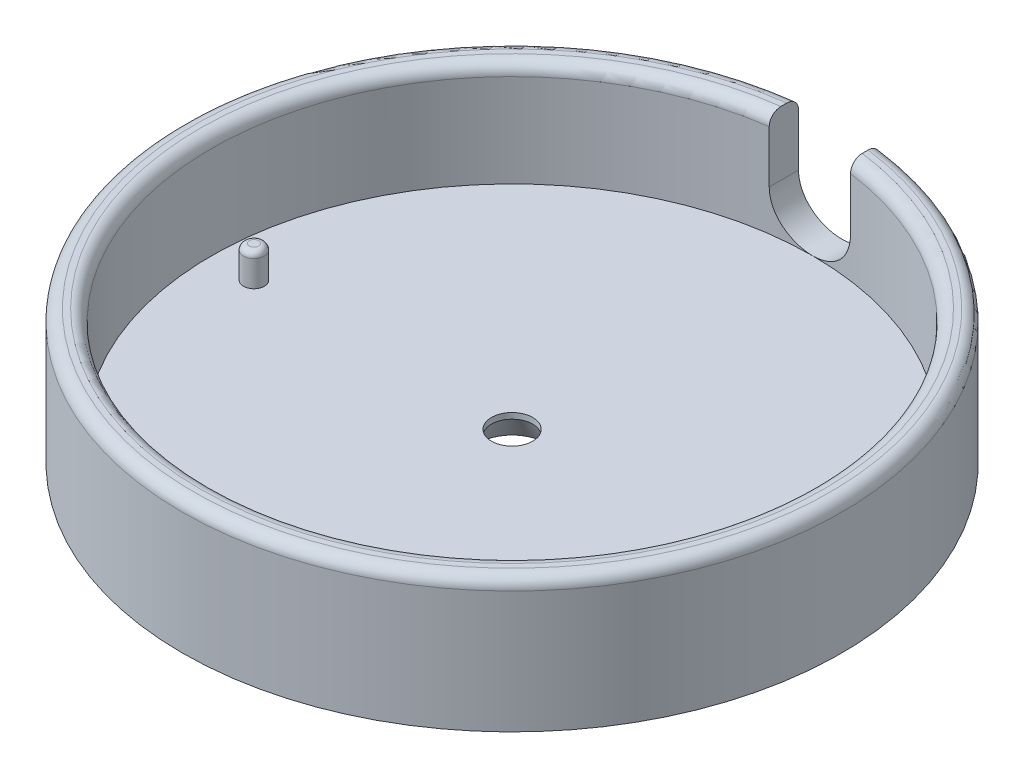
ISO-10303-21;
HEADER;
FILE_DESCRIPTION(('STEP AP214'),'2;1');
FILE_NAME('part.step','',(''),(''),'','','');
FILE_SCHEMA(('AUTOMOTIVE_DESIGN { 1 0 10303 214 1 1 1 1 }'));
ENDSEC;
DATA;
#1=APPLICATION_CONTEXT('core data for automotive mechanical design processes');
#2=APPLICATION_PROTOCOL_DEFINITION('international standard','automotive_design',2000,#1);
#3=PRODUCT_CONTEXT('',#1,'mechanical');
#4=PRODUCT('Part','Part','',(#3));
#5=PRODUCT_RELATED_PRODUCT_CATEGORY('part','',(#4));
#6=PRODUCT_DEFINITION_FORMATION('','',#4);
#7=PRODUCT_DEFINITION_CONTEXT('part definition',#1,'design');
#8=PRODUCT_DEFINITION('design','',#6,#7);
#9=PRODUCT_DEFINITION_SHAPE('','',#8);
#10=(LENGTH_UNIT() NAMED_UNIT(*) SI_UNIT(.MILLI.,.METRE.));
#11=(NAMED_UNIT(*) PLANE_ANGLE_UNIT() SI_UNIT($,.RADIAN.));
#12=(NAMED_UNIT(*) SI_UNIT($,.STERADIAN.) SOLID_ANGLE_UNIT());
#13=UNCERTAINTY_MEASURE_WITH_UNIT(LENGTH_MEASURE(1.E-05),#10,'distance_accuracy_value','');
#14=(GEOMETRIC_REPRESENTATION_CONTEXT(3) GLOBAL_UNCERTAINTY_ASSIGNED_CONTEXT((#13)) GLOBAL_UNIT_ASSIGNED_CONTEXT((#10,
#11,#12)) REPRESENTATION_CONTEXT('',''));
#15=CARTESIAN_POINT('',(0.,0.,0.));
#16=DIRECTION('',(0.,0.,1.));
#17=DIRECTION('',(1.,0.,0.));
#18=AXIS2_PLACEMENT_3D('',#15,#16,#17);
#19=CARTESIAN_POINT('',(0.,23.,0.));
#20=DIRECTION('',(0.,1.,0.));
#21=DIRECTION('',(0.,0.,1.));
#22=AXIS2_PLACEMENT_3D('',#19,#20,#21);
#23=PLANE('',#22);
#24=DIRECTION('',(0.,0.,-1.));
#25=VECTOR('',#24,1.);
#26=CARTESIAN_POINT('',(-7.,23.,-51.25));
#27=LINE('',#26,#25);
#28=CARTESIAN_POINT('',(-7.,23.,-53.2922367704715));
#29=VERTEX_POINT('',#28);
#30=CARTESIAN_POINT('',(-7.,23.,-54.3006675833732));
#31=VERTEX_POINT('',#30);
#32=EDGE_CURVE('E116',#29,#31,#27,.T.);
#33=ORIENTED_EDGE('',*,*,#32,.T.);
#34=CARTESIAN_POINT('',(0.,23.,0.));
#35=DIRECTION('',(0.,1.,0.));
#36=DIRECTION('',(0.,0.,1.));
#37=AXIS2_PLACEMENT_3D('',#34,#35,#36);
#38=CIRCLE('',#37,54.75);
#39=CARTESIAN_POINT('',(7.,23.,-54.3006675833732));
#40=VERTEX_POINT('',#39);
#41=EDGE_CURVE('E171',#31,#40,#38,.T.);
#42=ORIENTED_EDGE('',*,*,#41,.T.);
#43=DIRECTION('',(0.,0.,-1.));
#44=VECTOR('',#43,1.);
#45=CARTESIAN_POINT('',(7.,23.,-51.25));
#46=LINE('',#45,#44);
#47=CARTESIAN_POINT('',(7.,23.,-53.2922367704715));
#48=VERTEX_POINT('',#47);
#49=EDGE_CURVE('E127',#48,#40,#46,.T.);
#50=ORIENTED_EDGE('',*,*,#49,.F.);
#51=CARTESIAN_POINT('',(0.,23.,0.));
#52=DIRECTION('',(0.,1.,0.));
#53=DIRECTION('',(0.,0.,1.));
#54=AXIS2_PLACEMENT_3D('',#51,#52,#53);
#55=CIRCLE('',#54,53.75);
#56=EDGE_CURVE('E231',#48,#29,#55,.F.);
#57=ORIENTED_EDGE('',*,*,#56,.T.);
#58=EDGE_LOOP('',(#33,#42,#50,#57));
#59=FACE_BOUND('',#58,.T.);
#60=ADVANCED_FACE('F37',(#59),#23,.T.);
#61=CARTESIAN_POINT('',(0.,23.,0.));
#62=DIRECTION('',(0.,-1.,0.));
#63=DIRECTION('',(0.,0.,-1.));
#64=AXIS2_PLACEMENT_3D('',#61,#62,#63);
#65=CYLINDRICAL_SURFACE('',#64,56.75);
#66=DIRECTION('',(0.,-1.,0.));
#67=VECTOR('',#66,1.);
#68=CARTESIAN_POINT('',(7.,23.,-56.3166272072467));
#69=LINE('',#68,#67);
#70=CARTESIAN_POINT('',(7.,12.,-56.3166272072467));
#71=VERTEX_POINT('',#70);
#72=CARTESIAN_POINT('',(7.,21.,-56.3166272072467));
#73=VERTEX_POINT('',#72);
#74=EDGE_CURVE('E242',#71,#73,#69,.F.);
#75=ORIENTED_EDGE('',*,*,#74,.T.);
#76=CARTESIAN_POINT('',(0.,21.,0.));
#77=DIRECTION('',(0.,1.,0.));
#78=DIRECTION('',(0.,0.,1.));
#79=AXIS2_PLACEMENT_3D('',#76,#77,#78);
#80=CIRCLE('',#79,56.75);
#81=CARTESIAN_POINT('',(-7.,21.,-56.3166272072467));
#82=VERTEX_POINT('',#81);
#83=EDGE_CURVE('E52',#73,#82,#80,.F.);
#84=ORIENTED_EDGE('',*,*,#83,.T.);
#85=DIRECTION('',(0.,-1.,0.));
#86=VECTOR('',#85,1.);
#87=CARTESIAN_POINT('',(-7.,23.,-56.3166272072467));
#88=LINE('',#87,#86);
#89=CARTESIAN_POINT('',(-7.,12.,-56.3166272072467));
#90=VERTEX_POINT('',#89);
#91=EDGE_CURVE('E125',#90,#82,#88,.F.);
#92=ORIENTED_EDGE('',*,*,#91,.F.);
#93=CARTESIAN_POINT('',(7.,12.,-56.3166272072467));
#94=CARTESIAN_POINT('',(7.0000219947488,11.8039192833883,-56.3166167165276));
#95=CARTESIAN_POINT('',(6.99176215755773,11.6078427299237,-56.317650908035));
#96=CARTESIAN_POINT('',(6.95883845174181,11.2171072061736,-56.3217327137754));
#97=CARTESIAN_POINT('',(6.93417583371401,11.0224481289592,-56.3247801745107));
#98=CARTESIAN_POINT('',(6.86863942021842,10.6361225939024,-56.3328085232744));
#99=CARTESIAN_POINT('',(6.82778209952862,10.4444532998886,-56.3377874463279));
#100=CARTESIAN_POINT('',(6.73016541288054,10.0652660164368,-56.3495324227022));
#101=CARTESIAN_POINT('',(6.67340614414638,9.87774800162542,-56.3562984650966));
#102=CARTESIAN_POINT('',(6.54439015261551,9.50815825652045,-56.3714259910238));
#103=CARTESIAN_POINT('',(6.47213121349918,9.32608730935767,-56.3797877027047));
#104=CARTESIAN_POINT('',(6.31261496894473,8.96862873139894,-56.3978708341402));
#105=CARTESIAN_POINT('',(6.22535212563003,8.79324359761343,-56.4075927556947));
#106=CARTESIAN_POINT('',(6.03651433470211,8.45052735678081,-56.4281136094258));
#107=CARTESIAN_POINT('',(5.93494595489324,8.28319260076477,-56.438912046703));
#108=CARTESIAN_POINT('',(5.71814472768462,7.95758852430412,-56.4612893594266));
#109=CARTESIAN_POINT('',(5.60290682148673,7.79932259237323,-56.4728685231147));
#110=CARTESIAN_POINT('',(5.35906668017131,7.49234015590616,-56.4965305953659));
#111=CARTESIAN_POINT('',(5.23040781153958,7.34366878734962,-56.5086154982338));
#112=CARTESIAN_POINT('',(4.96100027032113,7.05762289775819,-56.5329043133369));
#113=CARTESIAN_POINT('',(4.82024714408787,6.92025257503889,-56.5451082679329));
#114=CARTESIAN_POINT('',(4.52770510511461,6.65785754123238,-56.569284223706));
#115=CARTESIAN_POINT('',(4.37591857480362,6.53283017861374,-56.5812562742548));
#116=CARTESIAN_POINT('',(4.06228159002892,6.29592199567634,-56.6046385094118));
#117=CARTESIAN_POINT('',(3.90042744317173,6.18404604275432,-56.6160484850916));
#118=CARTESIAN_POINT('',(3.56736236506161,5.97398977520248,-56.6380115550347));
#119=CARTESIAN_POINT('',(3.39612619778109,5.87584920454318,-56.6485621271987));
#120=CARTESIAN_POINT('',(3.04585974499131,5.69431503152571,-56.6684746197739));
#121=CARTESIAN_POINT('',(2.86682659168836,5.61092691330792,-56.6778360977829));
#122=CARTESIAN_POINT('',(2.50237836163341,5.45958592835696,-56.6950955844627));
#123=CARTESIAN_POINT('',(2.3169662387491,5.39162602527534,-56.7029942599702));
#124=CARTESIAN_POINT('',(1.94093612787971,5.27157273000776,-56.7171109570437));
#125=CARTESIAN_POINT('',(1.75031626135847,5.21948514787358,-56.7233283630888));
#126=CARTESIAN_POINT('',(1.36632334306685,5.13183144824462,-56.7338730770446));
#127=CARTESIAN_POINT('',(1.17297013023706,5.09617958993406,-56.7382101867272));
#128=CARTESIAN_POINT('',(0.783913130054273,5.04125903398579,-56.7449189907224));
#129=CARTESIAN_POINT('',(0.588209305099474,5.02199059878211,-56.7472906535519));
#130=CARTESIAN_POINT('',(0.195864225014644,4.99998276297641,-56.7500010705255));
#131=CARTESIAN_POINT('',(-0.000777011845855551,4.99724304154819,-56.750339864128));
#132=CARTESIAN_POINT('',(-0.393585748059021,5.00831241736332,-56.7489750149214));
#133=CARTESIAN_POINT('',(-0.589753248628854,5.02212147204262,-56.7472713773655));
#134=CARTESIAN_POINT('',(-0.979140420472035,5.06606434744224,-56.7418848172176));
#135=CARTESIAN_POINT('',(-1.17237032639893,5.09610887644951,-56.7382127216086));
#136=CARTESIAN_POINT('',(-1.55559379608271,5.17224112267777,-56.7289993343274));
#137=CARTESIAN_POINT('',(-1.74558742231589,5.21832852982234,-56.7234580787823));
#138=CARTESIAN_POINT('',(-2.12103928238718,5.32621912073602,-56.710660236408));
#139=CARTESIAN_POINT('',(-2.30649661725121,5.3880253923514,-56.7034033125691));
#140=CARTESIAN_POINT('',(-2.6714719288465,5.5268750987148,-56.6873803920868));
#141=CARTESIAN_POINT('',(-2.85099201471713,5.60391305321918,-56.6786149383473));
#142=CARTESIAN_POINT('',(-3.2034442681749,5.77294147345537,-56.6597889748952));
#143=CARTESIAN_POINT('',(-3.37635500002979,5.86497620978211,-56.6497246497804));
#144=CARTESIAN_POINT('',(-3.7137529198488,6.06314035435097,-56.6286067719244));
#145=CARTESIAN_POINT('',(-3.87824312695745,6.16926466109304,-56.6175535776996));
#146=CARTESIAN_POINT('',(-4.19778797290129,6.39492659273412,-56.594759011449));
#147=CARTESIAN_POINT('',(-4.35283919823904,6.51446902621754,-56.583017393441));
#148=CARTESIAN_POINT('',(-4.65231744745773,6.7660555299394,-56.5591814263943));
#149=CARTESIAN_POINT('',(-4.79674829161066,6.89809506535107,-56.5470872063984));
#150=CARTESIAN_POINT('',(-5.07501016998412,7.17475092700739,-56.5227955470212));
#151=CARTESIAN_POINT('',(-5.20876111030783,7.31944781404099,-56.510597971631));
#152=CARTESIAN_POINT('',(-5.46355852317211,7.61955921356125,-56.486532937262));
#153=CARTESIAN_POINT('',(-5.58460962324378,7.77496978778079,-56.4746653592063));
#154=CARTESIAN_POINT('',(-5.81328558888287,8.09557852403909,-56.4515848430717));
#155=CARTESIAN_POINT('',(-5.92090137354622,8.26078319584137,-56.4403723504582));
#156=CARTESIAN_POINT('',(-6.12180525963692,8.5996638102584,-56.4189348286499));
#157=CARTESIAN_POINT('',(-6.21509871223984,8.77333655687963,-56.4087094311847));
#158=CARTESIAN_POINT('',(-6.38685140026761,9.1282330355501,-56.3895212880484));
#159=CARTESIAN_POINT('',(-6.46528999225263,9.30946685466405,-56.3805603038439));
#160=CARTESIAN_POINT('',(-6.60657125544975,9.67790474021782,-56.3641798995163));
#161=CARTESIAN_POINT('',(-6.66941987242731,9.86510649974596,-56.3567598918658));
#162=CARTESIAN_POINT('',(-6.77903487798435,10.2439983766349,-56.3436796140353));
#163=CARTESIAN_POINT('',(-6.82581847881343,10.4356834537544,-56.3380174610968));
#164=CARTESIAN_POINT('',(-6.90302983079664,10.8222873505845,-56.3286090264939));
#165=CARTESIAN_POINT('',(-6.93346550841211,11.0172045558177,-56.3248618163924));
#166=CARTESIAN_POINT('',(-6.97041292359321,11.3437555761579,-56.3202988538142));
#167=CARTESIAN_POINT('',(-6.98151460865604,11.4748801495813,-56.3189226582198));
#168=CARTESIAN_POINT('',(-6.99630319355143,11.7373321163569,-56.3170867253703));
#169=CARTESIAN_POINT('',(-7.0000025158974,11.8686587991465,-56.3166254527192));
#170=CARTESIAN_POINT('',(-7.,12.,-56.3166272072467));
#171=B_SPLINE_CURVE_WITH_KNOTS('',3,(#93,#94,#95,#96,#97,#98,#99,#100,#101,#102,#103,#104,#105,
#106,#107,#108,#109,#110,#111,#112,#113,#114,#115,#116,#117,#118,#119,#120,#121,#122,#123,#124,
#125,#126,#127,#128,#129,#130,#131,#132,#133,#134,#135,#136,#137,#138,#139,#140,#141,#142,#143,
#144,#145,#146,#147,#148,#149,#150,#151,#152,#153,#154,#155,#156,#157,#158,#159,#160,#161,#162,
#163,#164,#165,#166,#167,#168,#169,#170),.UNSPECIFIED.,.F.,.F.,(4,2,2,2,2,2,2,2,2,2,2,2,2,2,2,2,
2,2,2,2,2,2,2,2,2,2,2,2,2,2,2,2,2,2,2,2,2,2,4),(0.,0.58805944615343,1.17607406203529,
1.76349202298622,2.35090639255734,2.93840481339397,3.52612054469861,4.11356732451133,
4.70123218803348,5.29148570216968,5.88195751328518,6.47230220115773,7.06286469495111,
7.65510216136117,8.24755932816906,8.83974574768157,9.43214867693543,10.0214252171703,
10.6107111964161,11.1999857374464,11.7892587628444,12.375323412985,12.9613767363088,
13.5475452742043,14.1335032956457,14.7212234940363,15.3087314702607,15.896450664944,
16.4839574055336,17.0755216212762,17.6668695303922,18.2586149910903,18.8501388202139,
19.4424787386882,20.034592399716,20.6260696691255,21.2172598951318,21.6118646349531,
22.0058065988666),.UNSPECIFIED.);
#172=EDGE_CURVE('E115',#71,#90,#171,.T.);
#173=ORIENTED_EDGE('',*,*,#172,.F.);
#174=EDGE_LOOP('',(#75,#84,#92,#173));
#175=FACE_BOUND('',#174,.T.);
#176=CARTESIAN_POINT('',(0.,0.,0.));
#177=DIRECTION('',(0.,1.,0.));
#178=DIRECTION('',(0.,0.,1.));
#179=AXIS2_PLACEMENT_3D('',#176,#177,#178);
#180=CIRCLE('',#179,56.75);
#181=CARTESIAN_POINT('',(0.,0.,56.75));
#182=VERTEX_POINT('',#181);
#183=EDGE_CURVE('E255',#182,#182,#180,.T.);
#184=ORIENTED_EDGE('',*,*,#183,.T.);
#185=EDGE_LOOP('',(#184));
#186=FACE_BOUND('',#185,.T.);
#187=ADVANCED_FACE('F197',(#175,#186),#65,.T.);
#188=CARTESIAN_POINT('',(0.,0.,0.));
#189=DIRECTION('',(0.,1.,0.));
#190=DIRECTION('',(0.,0.,1.));
#191=AXIS2_PLACEMENT_3D('',#188,#189,#190);
#192=PLANE('',#191);
#193=CARTESIAN_POINT('',(0.,0.,0.));
#194=DIRECTION('',(0.,1.,0.));
#195=DIRECTION('',(0.,0.,1.));
#196=AXIS2_PLACEMENT_3D('',#193,#194,#195);
#197=CIRCLE('',#196,5.8594010767585);
#198=CARTESIAN_POINT('',(0.,0.,5.8594010767585));
#199=VERTEX_POINT('',#198);
#200=EDGE_CURVE('E45',#199,#199,#197,.T.);
#201=ORIENTED_EDGE('',*,*,#200,.T.);
#202=EDGE_LOOP('',(#201));
#203=FACE_BOUND('',#202,.T.);
#204=ORIENTED_EDGE('',*,*,#183,.F.);
#205=EDGE_LOOP('',(#204));
#206=FACE_BOUND('',#205,.T.);
#207=ADVANCED_FACE('F188',(#203,#206),#192,.F.);
#208=CARTESIAN_POINT('',(0.,5.,0.));
#209=DIRECTION('',(0.,1.,0.));
#210=DIRECTION('',(0.,0.,1.));
#211=AXIS2_PLACEMENT_3D('',#208,#209,#210);
#212=CYLINDRICAL_SURFACE('',#211,51.75);
#213=DIRECTION('',(0.,1.,0.));
#214=VECTOR('',#213,1.);
#215=CARTESIAN_POINT('',(-7.,5.,-51.2743844429165));
#216=LINE('',#215,#214);
#217=CARTESIAN_POINT('',(-7.,21.,-51.2743844429165));
#218=VERTEX_POINT('',#217);
#219=CARTESIAN_POINT('',(-7.,12.,-51.2743844429165));
#220=VERTEX_POINT('',#219);
#221=EDGE_CURVE('E94',#218,#220,#216,.F.);
#222=ORIENTED_EDGE('',*,*,#221,.F.);
#223=CARTESIAN_POINT('',(0.,21.,0.));
#224=DIRECTION('',(0.,1.,0.));
#225=DIRECTION('',(0.,0.,1.));
#226=AXIS2_PLACEMENT_3D('',#223,#224,#225);
#227=CIRCLE('',#226,51.75);
#228=CARTESIAN_POINT('',(7.00000000000001,21.,-51.2743844429165));
#229=VERTEX_POINT('',#228);
#230=EDGE_CURVE('E229',#218,#229,#227,.T.);
#231=ORIENTED_EDGE('',*,*,#230,.T.);
#232=DIRECTION('',(0.,1.,0.));
#233=VECTOR('',#232,1.);
#234=CARTESIAN_POINT('',(7.00000000000001,5.,-51.2743844429165));
#235=LINE('',#234,#233);
#236=CARTESIAN_POINT('',(7.,12.,-51.2743844429165));
#237=VERTEX_POINT('',#236);
#238=EDGE_CURVE('E105',#229,#237,#235,.F.);
#239=ORIENTED_EDGE('',*,*,#238,.T.);
#240=CARTESIAN_POINT('',(-7.,12.,-51.2743844429165));
#241=CARTESIAN_POINT('',(-7.00002216184348,11.8040810672263,-51.2743729022585));
#242=CARTESIAN_POINT('',(-6.99177575761946,11.6081665273113,-51.2755069570741));
#243=CARTESIAN_POINT('',(-6.95890681418778,11.2177569016567,-51.2799826855686));
#244=CARTESIAN_POINT('',(-6.93428561867616,11.0232617007716,-51.2833241781077));
#245=CARTESIAN_POINT('',(-6.8688633133122,10.6372769174035,-51.2921264896969));
#246=CARTESIAN_POINT('',(-6.82807966941835,10.4457843216167,-51.2975850208327));
#247=CARTESIAN_POINT('',(-6.73064346041029,10.0669492577165,-51.3104606047587));
#248=CARTESIAN_POINT('',(-6.67399097259065,9.87960676939345,-51.3178776480095));
#249=CARTESIAN_POINT('',(-6.54522534210308,9.51036936664831,-51.3344594906231));
#250=CARTESIAN_POINT('',(-6.4731104397235,9.32847507494984,-51.3436244889001));
#251=CARTESIAN_POINT('',(-6.31391906477496,8.97136032600304,-51.3634437997712));
#252=CARTESIAN_POINT('',(-6.22683706653292,8.79614236286731,-51.3740986621334));
#253=CARTESIAN_POINT('',(-6.03839508941816,8.45374058869913,-51.3965882099844));
#254=CARTESIAN_POINT('',(-5.93704135049934,8.2865533090727,-51.408422379194));
#255=CARTESIAN_POINT('',(-5.72070282074131,7.9612211496116,-51.4329457604748));
#256=CARTESIAN_POINT('',(-5.60571297772163,7.80307965361218,-51.4456352887006));
#257=CARTESIAN_POINT('',(-5.36228184041414,7.49616803595285,-51.4715794522785));
#258=CARTESIAN_POINT('',(-5.23377162099643,7.34745280503391,-51.4848367565673));
#259=CARTESIAN_POINT('',(-4.96466224300956,7.06130396340714,-51.5114833074148));
#260=CARTESIAN_POINT('',(-4.82405862980985,6.92387454660838,-51.5248726009701));
#261=CARTESIAN_POINT('',(-4.5318113786974,6.66134286392287,-51.5513986567193));
#262=CARTESIAN_POINT('',(-4.38017011960949,6.53623795546587,-51.5645354725601));
#263=CARTESIAN_POINT('',(-4.06681405455646,6.29915464585703,-51.5901951914401));
#264=CARTESIAN_POINT('',(-3.90509555322316,6.18718110393061,-51.6027178662271));
#265=CARTESIAN_POINT('',(-3.5721752589776,5.97683893356187,-51.6268342082818));
#266=CARTESIAN_POINT('',(-3.40094219494037,5.87851939852008,-51.6384244632344));
#267=CARTESIAN_POINT('',(-3.05065226291801,5.69662933651498,-51.660302193743));
#268=CARTESIAN_POINT('',(-2.87159251319398,5.61306430012042,-51.6705891839164));
#269=CARTESIAN_POINT('',(-2.50706170198913,5.46137656914657,-51.6895582564406));
#270=CARTESIAN_POINT('',(-2.32159364083547,5.39324675785051,-51.6982410780829));
#271=CARTESIAN_POINT('',(-1.94542279818144,5.27286518525069,-51.7137629190901));
#272=CARTESIAN_POINT('',(-1.75471813016429,5.2206192302386,-51.7206012641098));
#273=CARTESIAN_POINT('',(-1.37072746779696,5.13271116290251,-51.732197592694));
#274=CARTESIAN_POINT('',(-1.17746529271225,5.09694668486497,-51.7369684062566));
#275=CARTESIAN_POINT('',(-0.788574257609988,5.04178755451405,-51.7443569065104));
#276=CARTESIAN_POINT('',(-0.592945362247755,5.0223931469787,-51.7469745610059));
#277=CARTESIAN_POINT('',(-0.200737550325664,5.00012255024661,-51.7499822417683));
#278=CARTESIAN_POINT('',(-0.0041586583451725,4.997245935949,-51.7503723253637));
#279=CARTESIAN_POINT('',(0.388536199509347,5.00803170503828,-51.7489139229282));
#280=CARTESIAN_POINT('',(0.584652166818142,5.02169403709751,-51.7470654438445));
#281=CARTESIAN_POINT('',(0.973729526557351,5.06531030627581,-51.7412017563319));
#282=CARTESIAN_POINT('',(1.16670316468783,5.09515702868667,-51.7372008084496));
#283=CARTESIAN_POINT('',(1.54942881761031,5.17084766569479,-51.7271535705104));
#284=CARTESIAN_POINT('',(1.73918089349109,5.21669127659555,-51.7211073192831));
#285=CARTESIAN_POINT('',(2.11416812545289,5.32404792127013,-51.7071368955167));
#286=CARTESIAN_POINT('',(2.29940238291037,5.38556404500267,-51.6992123526793));
#287=CARTESIAN_POINT('',(2.66395558603132,5.52378747309713,-51.6817098606289));
#288=CARTESIAN_POINT('',(2.84327662237075,5.60048933973493,-51.6721325034142));
#289=CARTESIAN_POINT('',(3.19544757874166,5.76884122082567,-51.6515521503501));
#290=CARTESIAN_POINT('',(3.36827263823378,5.86054264208056,-51.6405442794595));
#291=CARTESIAN_POINT('',(3.70552906955058,6.05801169096688,-51.6174400578305));
#292=CARTESIAN_POINT('',(3.86996343669308,6.16377424973527,-51.6053440998396));
#293=CARTESIAN_POINT('',(4.18943419324638,6.3886884671775,-51.5803918811901));
#294=CARTESIAN_POINT('',(4.34446710786809,6.50784503041764,-51.5675353428467));
#295=CARTESIAN_POINT('',(4.64395188132815,6.7586409094415,-51.5414280118262));
#296=CARTESIAN_POINT('',(4.78840752836635,6.89027571705762,-51.5281773627127));
#297=CARTESIAN_POINT('',(5.06695549922021,7.1662931758256,-51.5015359291422));
#298=CARTESIAN_POINT('',(5.20095242767406,7.31077209198924,-51.4881448908473));
#299=CARTESIAN_POINT('',(5.45626094610827,7.61047231538512,-51.4617157360925));
#300=CARTESIAN_POINT('',(5.57757714753103,7.76568968313273,-51.4486774926235));
#301=CARTESIAN_POINT('',(5.80680179558512,8.0859413944136,-51.4233105123387));
#302=CARTESIAN_POINT('',(5.91470120807606,8.2509822431552,-51.410982256557));
#303=CARTESIAN_POINT('',(6.11618846180543,8.58956989008754,-51.387401455213));
#304=CARTESIAN_POINT('',(6.20978166266445,8.7631134705144,-51.3761485073968));
#305=CARTESIAN_POINT('',(6.38215886767797,9.11781521349065,-51.3550202473319));
#306=CARTESIAN_POINT('',(6.46092012001294,9.29898456127053,-51.3451470574829));
#307=CARTESIAN_POINT('',(6.60284907921485,9.66733544131752,-51.3270884023128));
#308=CARTESIAN_POINT('',(6.66602274939222,9.85451464333821,-51.3189022917671));
#309=CARTESIAN_POINT('',(6.77628424262962,10.2334037152416,-51.3044594867728));
#310=CARTESIAN_POINT('',(6.82338920792942,10.4251085221701,-51.2982007368962));
#311=CARTESIAN_POINT('',(6.9012335462396,10.8117899100924,-51.2877862703881));
#312=CARTESIAN_POINT('',(6.93198083074677,11.0067648623039,-51.2836295371511));
#313=CARTESIAN_POINT('',(6.96962518267486,11.3350955135667,-51.2785243311671));
#314=CARTESIAN_POINT('',(6.98102230375038,11.4679430407033,-51.2769726985756));
#315=CARTESIAN_POINT('',(6.99620471912564,11.7338559979835,-51.274902589752));
#316=CARTESIAN_POINT('',(7.00000278809983,11.8669206854363,-51.2743823796214));
#317=CARTESIAN_POINT('',(7.,12.,-51.2743844429165));
#318=B_SPLINE_CURVE_WITH_KNOTS('',3,(#240,#241,#242,#243,#244,#245,#246,#247,#248,#249,#250,
#251,#252,#253,#254,#255,#256,#257,#258,#259,#260,#261,#262,#263,#264,#265,#266,#267,#268,#269,
#270,#271,#272,#273,#274,#275,#276,#277,#278,#279,#280,#281,#282,#283,#284,#285,#286,#287,#288,
#289,#290,#291,#292,#293,#294,#295,#296,#297,#298,#299,#300,#301,#302,#303,#304,#305,#306,#307,
#308,#309,#310,#311,#312,#313,#314,#315,#316,#317),.UNSPECIFIED.,.F.,.F.,(4,2,2,2,2,2,2,2,2,2,2,
2,2,2,2,2,2,2,2,2,2,2,2,2,2,2,2,2,2,2,2,2,2,2,2,2,2,2,4),(0.,0.587573594953165,1.17509898025889,
1.76199117972711,2.34888052058839,2.93583668831514,3.52301002055756,4.10992741884239,
4.69706295361122,5.28735173240414,5.8778588843878,6.46823914541952,7.05883719021283,
7.65150661834189,8.24439613291392,8.83701172514841,9.42984368632336,10.0189422524598,
10.6080496271003,11.197141840443,11.7862322255773,12.3714669819715,12.9566906284499,
13.5420297457659,14.1271596421953,14.7143386253674,15.3013065089559,15.8884900307484,
16.475462216276,17.0672799582572,17.658881726934,18.2508797155946,18.8426553740893,
19.4353315353771,20.0277806049354,20.6195956532995,21.2111242057123,21.6109507316111,
22.0101045473242),.UNSPECIFIED.);
#319=CARTESIAN_POINT('',(0.,5.,-51.75));
#320=VERTEX_POINT('',#319);
#321=EDGE_CURVE('E123',#320,#237,#318,.T.);
#322=ORIENTED_EDGE('',*,*,#321,.F.);
#323=CARTESIAN_POINT('',(0.,5.,0.));
#324=DIRECTION('',(0.,1.,0.));
#325=DIRECTION('',(0.,0.,1.));
#326=AXIS2_PLACEMENT_3D('',#323,#324,#325);
#327=CIRCLE('',#326,51.75);
#328=EDGE_CURVE('E122',#320,#320,#327,.T.);
#329=ORIENTED_EDGE('',*,*,#328,.F.);
#330=EDGE_CURVE('E111',#220,#320,#318,.T.);
#331=ORIENTED_EDGE('',*,*,#330,.F.);
#332=EDGE_LOOP('',(#222,#231,#239,#322,#329,#331));
#333=FACE_BOUND('',#332,.T.);
#334=ADVANCED_FACE('F120',(#333),#212,.F.);
#335=CARTESIAN_POINT('',(0.,5.,0.));
#336=DIRECTION('',(0.,1.,0.));
#337=DIRECTION('',(0.,0.,1.));
#338=AXIS2_PLACEMENT_3D('',#335,#336,#337);
#339=PLANE('',#338);
#340=CARTESIAN_POINT('',(44.45,5.,0.));
#341=DIRECTION('',(0.,1.,0.));
#342=DIRECTION('',(0.,0.,1.));
#343=AXIS2_PLACEMENT_3D('',#340,#341,#342);
#344=CIRCLE('',#343,1.8);
#345=CARTESIAN_POINT('',(44.45,5.,1.8));
#346=VERTEX_POINT('',#345);
#347=EDGE_CURVE('E243',#346,#346,#344,.T.);
#348=ORIENTED_EDGE('',*,*,#347,.F.);
#349=EDGE_LOOP('',(#348));
#350=FACE_BOUND('',#349,.T.);
#351=CARTESIAN_POINT('',(-44.45,5.,0.));
#352=DIRECTION('',(0.,1.,0.));
#353=DIRECTION('',(0.,0.,1.));
#354=AXIS2_PLACEMENT_3D('',#351,#352,#353);
#355=CIRCLE('',#354,1.8);
#356=CARTESIAN_POINT('',(-44.45,5.,1.8));
#357=VERTEX_POINT('',#356);
#358=EDGE_CURVE('E248',#357,#357,#355,.T.);
#359=ORIENTED_EDGE('',*,*,#358,.F.);
#360=EDGE_LOOP('',(#359));
#361=FACE_BOUND('',#360,.T.);
#362=CARTESIAN_POINT('',(0.,5.,0.));
#363=DIRECTION('',(0.,1.,0.));
#364=DIRECTION('',(0.,0.,1.));
#365=AXIS2_PLACEMENT_3D('',#362,#363,#364);
#366=CIRCLE('',#365,3.55);
#367=CARTESIAN_POINT('',(0.,5.,3.55));
#368=VERTEX_POINT('',#367);
#369=EDGE_CURVE('E251',#368,#368,#366,.T.);
#370=ORIENTED_EDGE('',*,*,#369,.F.);
#371=EDGE_LOOP('',(#370));
#372=FACE_BOUND('',#371,.T.);
#373=ORIENTED_EDGE('',*,*,#328,.T.);
#374=EDGE_LOOP('',(#373));
#375=FACE_BOUND('',#374,.T.);
#376=ADVANCED_FACE('F276',(#350,#361,#372,#375),#339,.T.);
#377=CARTESIAN_POINT('',(0.,0.,0.));
#378=DIRECTION('',(0.,1.,0.));
#379=DIRECTION('',(0.,0.,1.));
#380=AXIS2_PLACEMENT_3D('',#377,#378,#379);
#381=CYLINDRICAL_SURFACE('',#380,3.55);
#382=CARTESIAN_POINT('',(0.,4.00000000000002,0.));
#383=DIRECTION('',(0.,1.,0.));
#384=DIRECTION('',(0.,0.,1.));
#385=AXIS2_PLACEMENT_3D('',#382,#383,#384);
#386=CIRCLE('',#385,3.55);
#387=CARTESIAN_POINT('',(0.,4.00000000000002,3.55));
#388=VERTEX_POINT('',#387);
#389=EDGE_CURVE('E11',#388,#388,#386,.F.);
#390=ORIENTED_EDGE('',*,*,#389,.T.);
#391=EDGE_LOOP('',(#390));
#392=FACE_BOUND('',#391,.T.);
#393=ORIENTED_EDGE('',*,*,#369,.T.);
#394=EDGE_LOOP('',(#393));
#395=FACE_BOUND('',#394,.T.);
#396=ADVANCED_FACE('F271',(#392,#395),#381,.F.);
#397=CARTESIAN_POINT('',(-44.45,10.5,0.));
#398=DIRECTION('',(0.,-1.,0.));
#399=DIRECTION('',(0.,0.,-1.));
#400=AXIS2_PLACEMENT_3D('',#397,#398,#399);
#401=CYLINDRICAL_SURFACE('',#400,1.8);
#402=CARTESIAN_POINT('',(-44.45,9.5,0.));
#403=DIRECTION('',(0.,1.,0.));
#404=DIRECTION('',(0.,0.,1.));
#405=AXIS2_PLACEMENT_3D('',#402,#403,#404);
#406=CIRCLE('',#405,1.8);
#407=CARTESIAN_POINT('',(-44.45,9.5,1.8));
#408=VERTEX_POINT('',#407);
#409=EDGE_CURVE('E221',#408,#408,#406,.F.);
#410=ORIENTED_EDGE('',*,*,#409,.T.);
#411=EDGE_LOOP('',(#410));
#412=FACE_BOUND('',#411,.T.);
#413=ORIENTED_EDGE('',*,*,#358,.T.);
#414=EDGE_LOOP('',(#413));
#415=FACE_BOUND('',#414,.T.);
#416=ADVANCED_FACE('F264',(#412,#415),#401,.T.);
#417=CARTESIAN_POINT('',(-44.45,10.5,0.));
#418=DIRECTION('',(0.,1.,0.));
#419=DIRECTION('',(0.,0.,1.));
#420=AXIS2_PLACEMENT_3D('',#417,#418,#419);
#421=PLANE('',#420);
#422=CARTESIAN_POINT('',(-44.45,10.5,0.));
#423=DIRECTION('',(0.,1.,0.));
#424=DIRECTION('',(0.,0.,1.));
#425=AXIS2_PLACEMENT_3D('',#422,#423,#424);
#426=CIRCLE('',#425,0.800000000000001);
#427=CARTESIAN_POINT('',(-44.45,10.5,0.800000000000001));
#428=VERTEX_POINT('',#427);
#429=EDGE_CURVE('E225',#428,#428,#426,.T.);
#430=ORIENTED_EDGE('',*,*,#429,.T.);
#431=EDGE_LOOP('',(#430));
#432=FACE_BOUND('',#431,.T.);
#433=ADVANCED_FACE('F260',(#432),#421,.T.);
#434=CARTESIAN_POINT('',(44.45,10.5,0.));
#435=DIRECTION('',(0.,-1.,0.));
#436=DIRECTION('',(0.,0.,-1.));
#437=AXIS2_PLACEMENT_3D('',#434,#435,#436);
#438=CYLINDRICAL_SURFACE('',#437,1.8);
#439=CARTESIAN_POINT('',(44.45,9.5,0.));
#440=DIRECTION('',(0.,1.,0.));
#441=DIRECTION('',(0.,0.,1.));
#442=AXIS2_PLACEMENT_3D('',#439,#440,#441);
#443=CIRCLE('',#442,1.8);
#444=CARTESIAN_POINT('',(44.45,9.5,1.8));
#445=VERTEX_POINT('',#444);
#446=EDGE_CURVE('E106',#445,#445,#443,.F.);
#447=ORIENTED_EDGE('',*,*,#446,.T.);
#448=EDGE_LOOP('',(#447));
#449=FACE_BOUND('',#448,.T.);
#450=ORIENTED_EDGE('',*,*,#347,.T.);
#451=EDGE_LOOP('',(#450));
#452=FACE_BOUND('',#451,.T.);
#453=ADVANCED_FACE('F263',(#449,#452),#438,.T.);
#454=CARTESIAN_POINT('',(44.45,10.5,0.));
#455=DIRECTION('',(0.,1.,0.));
#456=DIRECTION('',(0.,0.,1.));
#457=AXIS2_PLACEMENT_3D('',#454,#455,#456);
#458=PLANE('',#457);
#459=CARTESIAN_POINT('',(44.45,10.5,0.));
#460=DIRECTION('',(0.,1.,0.));
#461=DIRECTION('',(0.,0.,1.));
#462=AXIS2_PLACEMENT_3D('',#459,#460,#461);
#463=CIRCLE('',#462,0.800000000000001);
#464=CARTESIAN_POINT('',(44.45,10.5,0.800000000000001));
#465=VERTEX_POINT('',#464);
#466=EDGE_CURVE('E219',#465,#465,#463,.T.);
#467=ORIENTED_EDGE('',*,*,#466,.T.);
#468=EDGE_LOOP('',(#467));
#469=FACE_BOUND('',#468,.T.);
#470=ADVANCED_FACE('F154',(#469),#458,.T.);
#471=CARTESIAN_POINT('',(-44.45,9.5,0.));
#472=DIRECTION('',(0.,1.,0.));
#473=DIRECTION('',(0.,0.,1.));
#474=AXIS2_PLACEMENT_3D('',#471,#472,#473);
#475=DEGENERATE_TOROIDAL_SURFACE('',#474,0.800000000000001,1.,.T.);
#476=ORIENTED_EDGE('',*,*,#409,.F.);
#477=EDGE_LOOP('',(#476));
#478=FACE_BOUND('',#477,.T.);
#479=ORIENTED_EDGE('',*,*,#429,.F.);
#480=EDGE_LOOP('',(#479));
#481=FACE_BOUND('',#480,.T.);
#482=ADVANCED_FACE('F207',(#478,#481),#475,.T.);
#483=CARTESIAN_POINT('',(44.45,9.5,0.));
#484=DIRECTION('',(0.,1.,0.));
#485=DIRECTION('',(0.,0.,1.));
#486=AXIS2_PLACEMENT_3D('',#483,#484,#485);
#487=DEGENERATE_TOROIDAL_SURFACE('',#486,0.800000000000001,1.,.T.);
#488=ORIENTED_EDGE('',*,*,#446,.F.);
#489=EDGE_LOOP('',(#488));
#490=FACE_BOUND('',#489,.T.);
#491=ORIENTED_EDGE('',*,*,#466,.F.);
#492=EDGE_LOOP('',(#491));
#493=FACE_BOUND('',#492,.T.);
#494=ADVANCED_FACE('F153',(#490,#493),#487,.T.);
#495=CARTESIAN_POINT('',(7.,23.,-51.25));
#496=DIRECTION('',(1.,0.,0.));
#497=DIRECTION('',(0.,1.,0.));
#498=AXIS2_PLACEMENT_3D('',#495,#496,#497);
#499=PLANE('',#498);
#500=ORIENTED_EDGE('',*,*,#49,.T.);
#501=CARTESIAN_POINT('',(7.,23.,-54.3006675833732));
#502=CARTESIAN_POINT('',(7.,22.9999993728112,-54.357724479213));
#503=CARTESIAN_POINT('',(7.,22.9975968055172,-54.4147542120023));
#504=CARTESIAN_POINT('',(7.,22.9880095554231,-54.5284085103788));
#505=CARTESIAN_POINT('',(7.,22.9808250116552,-54.5850330876972));
#506=CARTESIAN_POINT('',(7.,22.9521577698079,-54.7536195362722));
#507=CARTESIAN_POINT('',(7.,22.9235613184563,-54.8644566660411));
#508=CARTESIAN_POINT('',(7.,22.8481482513553,-55.0797601209661));
#509=CARTESIAN_POINT('',(7.,22.8013212017045,-55.1842227581395));
#510=CARTESIAN_POINT('',(7.,22.6907332866712,-55.3837522462325));
#511=CARTESIAN_POINT('',(7.,22.6269766281342,-55.4788214232952));
#512=CARTESIAN_POINT('',(7.,22.4845789344836,-55.6564485966451));
#513=CARTESIAN_POINT('',(7.,22.4059975790424,-55.7390544459454));
#514=CARTESIAN_POINT('',(7.,22.2359670104668,-55.8897969342433));
#515=CARTESIAN_POINT('',(7.,22.1445154721368,-55.9579309530892));
#516=CARTESIAN_POINT('',(7.,21.9520914867612,-56.077231666214));
#517=CARTESIAN_POINT('',(7.,21.8511942127334,-56.128519762534));
#518=CARTESIAN_POINT('',(7.,21.6422041889696,-56.2132660278028));
#519=CARTESIAN_POINT('',(7.,21.5341165101397,-56.2467366153743));
#520=CARTESIAN_POINT('',(7.,21.3544045123721,-56.2860352709754));
#521=CARTESIAN_POINT('',(7.,21.2839629713815,-56.2975004968124));
#522=CARTESIAN_POINT('',(7.,21.1423580319752,-56.3127949690572));
#523=CARTESIAN_POINT('',(7.,21.0711958113008,-56.3166351233207));
#524=CARTESIAN_POINT('',(7.,21.,-56.3166272072467));
#525=B_SPLINE_CURVE_WITH_KNOTS('',3,(#501,#502,#503,#504,#505,#506,#507,#508,#509,#510,#511,
#512,#513,#514,#515,#516,#517,#518,#519,#520,#521,#522,#523,#524),.UNSPECIFIED.,.F.,.F.,(4,2,2,
2,2,2,2,2,2,2,2,4),(0.,0.171066060453684,0.3421271475132,0.683767877607545,1.02560442675455,
1.36735611215773,1.70776028543868,2.04822603708643,2.38618141105584,2.72390092412243,
2.93762533049675,3.15104377785694),.UNSPECIFIED.);
#526=EDGE_CURVE('E60',#40,#73,#525,.T.);
#527=ORIENTED_EDGE('',*,*,#526,.T.);
#528=ORIENTED_EDGE('',*,*,#74,.F.);
#529=DIRECTION('',(0.,0.,-1.));
#530=VECTOR('',#529,1.);
#531=CARTESIAN_POINT('',(7.,12.,-51.25));
#532=LINE('',#531,#530);
#533=EDGE_CURVE('E117',#237,#71,#532,.T.);
#534=ORIENTED_EDGE('',*,*,#533,.F.);
#535=ORIENTED_EDGE('',*,*,#238,.F.);
#536=CARTESIAN_POINT('',(7.00000000000001,21.,-51.2743844429165));
#537=CARTESIAN_POINT('',(7.,21.0558982246239,-51.2743845309678));
#538=CARTESIAN_POINT('',(7.,21.1117695333946,-51.2767511467175));
#539=CARTESIAN_POINT('',(7.,21.2231093576056,-51.286190612573));
#540=CARTESIAN_POINT('',(7.,21.2785778997735,-51.2932631474561));
#541=CARTESIAN_POINT('',(7.,21.4436565954216,-51.3214638937543));
#542=CARTESIAN_POINT('',(7.,21.552156172451,-51.3495754852239));
#543=CARTESIAN_POINT('',(7.,21.7628850844139,-51.4235978070952));
#544=CARTESIAN_POINT('',(7.,21.8651119745402,-51.469515427075));
#545=CARTESIAN_POINT('',(7.,22.0604522607091,-51.5777897340974));
#546=CARTESIAN_POINT('',(7.,22.1535665671959,-51.6401447765623));
#547=CARTESIAN_POINT('',(7.,22.3284709175537,-51.779767790329));
#548=CARTESIAN_POINT('',(7.,22.4102126899371,-51.8570961860959));
#549=CARTESIAN_POINT('',(7.,22.5597055067809,-52.0242903842754));
#550=CARTESIAN_POINT('',(7.,22.6274535629692,-52.1141588576936));
#551=CARTESIAN_POINT('',(7.,22.7476466881722,-52.3047055704347));
#552=CARTESIAN_POINT('',(7.,22.799951725444,-52.4054720428751));
#553=CARTESIAN_POINT('',(7.,22.8870280264486,-52.6142929060643));
#554=CARTESIAN_POINT('',(7.,22.9218074839906,-52.7223438642255));
#555=CARTESIAN_POINT('',(7.,22.9648549781359,-52.9078335935187));
#556=CARTESIAN_POINT('',(7.,22.9780257903554,-52.984171975466));
#557=CARTESIAN_POINT('',(7.,22.9955976912193,-53.1377425442305));
#558=CARTESIAN_POINT('',(7.,23.0000110761472,-53.2149733244538));
#559=CARTESIAN_POINT('',(7.,23.,-53.2922367704715));
#560=B_SPLINE_CURVE_WITH_KNOTS('',3,(#536,#537,#538,#539,#540,#541,#542,#543,#544,#545,#546,
#547,#548,#549,#550,#551,#552,#553,#554,#555,#556,#557,#558,#559),.UNSPECIFIED.,.F.,.F.,(4,2,2,
2,2,2,2,2,2,2,2,4),(0.,0.167591205259105,0.335171185665711,0.669690381186059,1.00433913953513,
1.33895442869617,1.67494930046389,2.01101584786501,2.35004220619194,2.68890991067053,
2.92083676516346,3.15243774060804),.UNSPECIFIED.);
#561=EDGE_CURVE('E158',#229,#48,#560,.T.);
#562=ORIENTED_EDGE('',*,*,#561,.T.);
#563=EDGE_LOOP('',(#500,#527,#528,#534,#535,#562));
#564=FACE_BOUND('',#563,.T.);
#565=ADVANCED_FACE('F148',(#564),#499,.F.);
#566=CARTESIAN_POINT('',(-7.,23.,-51.25));
#567=DIRECTION('',(1.,0.,0.));
#568=DIRECTION('',(0.,1.,0.));
#569=AXIS2_PLACEMENT_3D('',#566,#567,#568);
#570=PLANE('',#569);
#571=ORIENTED_EDGE('',*,*,#91,.T.);
#572=CARTESIAN_POINT('',(-7.,21.,-56.3166272072467));
#573=CARTESIAN_POINT('',(-7.,21.0559540810548,-56.316627053482));
#574=CARTESIAN_POINT('',(-7.,21.1118812503183,-56.3142594897725));
#575=CARTESIAN_POINT('',(-7.,21.2233330480782,-56.3048158052445));
#576=CARTESIAN_POINT('',(-7.,21.2788577016112,-56.2977399798666));
#577=CARTESIAN_POINT('',(-7.,21.4441104363353,-56.2695240551419));
#578=CARTESIAN_POINT('',(-7.,21.5527278196584,-56.2413952801855));
#579=CARTESIAN_POINT('',(-7.,21.7636893919517,-56.1673153202914));
#580=CARTESIAN_POINT('',(-7.,21.8660310035532,-56.1213568689841));
#581=CARTESIAN_POINT('',(-7.,22.0615818819851,-56.0129685004042));
#582=CARTESIAN_POINT('',(-7.,22.1547922139655,-55.950540507424));
#583=CARTESIAN_POINT('',(-7.,22.3297807533065,-55.8107923516189));
#584=CARTESIAN_POINT('',(-7.,22.4115204660441,-55.7334240207641));
#585=CARTESIAN_POINT('',(-7.,22.5609806584525,-55.5661342097427));
#586=CARTESIAN_POINT('',(-7.,22.6286982308554,-55.4762101327997));
#587=CARTESIAN_POINT('',(-7.,22.7487087822873,-55.2856720342297));
#588=CARTESIAN_POINT('',(-7.,22.8008832704243,-55.1849834664229));
#589=CARTESIAN_POINT('',(-7.,22.8877039101937,-54.9763358867306));
#590=CARTESIAN_POINT('',(-7.,22.9223582754787,-54.8683803086591));
#591=CARTESIAN_POINT('',(-7.,22.9651465366437,-54.6833259840126));
#592=CARTESIAN_POINT('',(-7.,22.9782092207295,-54.6073288571349));
#593=CARTESIAN_POINT('',(-7.,22.9956352230677,-54.4544534857033));
#594=CARTESIAN_POINT('',(-7.,23.0000108993364,-54.3775766495362));
#595=CARTESIAN_POINT('',(-7.,23.,-54.3006675833732));
#596=B_SPLINE_CURVE_WITH_KNOTS('',3,(#572,#573,#574,#575,#576,#577,#578,#579,#580,#581,#582,
#583,#584,#585,#586,#587,#588,#589,#590,#591,#592,#593,#594,#595),.UNSPECIFIED.,.F.,.F.,(4,2,2,
2,2,2,2,2,2,2,2,4),(0.,0.167758774642439,0.335507023512942,0.670380003966156,1.00538960335631,
1.34036007773045,1.67642910118149,2.01256773358928,2.35120690001599,2.68968716060958,
2.92055584386138,3.15109586052675),.UNSPECIFIED.);
#597=EDGE_CURVE('E181',#82,#31,#596,.T.);
#598=ORIENTED_EDGE('',*,*,#597,.T.);
#599=ORIENTED_EDGE('',*,*,#32,.F.);
#600=CARTESIAN_POINT('',(-7.,23.,-53.2922367704715));
#601=CARTESIAN_POINT('',(-7.,22.9999993627028,-53.2351027770386));
#602=CARTESIAN_POINT('',(-7.,22.9975918197418,-53.1779960977864));
#603=CARTESIAN_POINT('',(-7.,22.9879861927199,-53.0641890908504));
#604=CARTESIAN_POINT('',(-7.,22.9807882696542,-53.0074887495751));
#605=CARTESIAN_POINT('',(-7.,22.9520707006464,-52.8386783750251));
#606=CARTESIAN_POINT('',(-7.,22.9234271027884,-52.7276953582335));
#607=CARTESIAN_POINT('',(-7.,22.847901701174,-52.5121105652422));
#608=CARTESIAN_POINT('',(-7.,22.8010098476829,-52.4075123420797));
#609=CARTESIAN_POINT('',(-7.,22.6902758038832,-52.2077195970243));
#610=CARTESIAN_POINT('',(-7.,22.6264376747637,-52.1125228295543));
#611=CARTESIAN_POINT('',(-7.,22.4838364267985,-51.9346286389085));
#612=CARTESIAN_POINT('',(-7.,22.4051285703167,-51.851886910728));
#613=CARTESIAN_POINT('',(-7.,22.2348140406111,-51.7009085538825));
#614=CARTESIAN_POINT('',(-7.,22.1432051009219,-51.632674479223));
#615=CARTESIAN_POINT('',(-7.,21.9505141947303,-51.513276284506));
#616=CARTESIAN_POINT('',(-7.,21.8495155569064,-51.461977520407));
#617=CARTESIAN_POINT('',(-7.,21.6403142986813,-51.3772564258555));
#618=CARTESIAN_POINT('',(-7.,21.532116904421,-51.3438212826589));
#619=CARTESIAN_POINT('',(-7.,21.3526357487086,-51.3047169321952));
#620=CARTESIAN_POINT('',(-7.,21.282542621381,-51.2933490742849));
#621=CARTESIAN_POINT('',(-7.,21.1416434721338,-51.2781843095881));
#622=CARTESIAN_POINT('',(-7.,21.0708386089471,-51.2743766329416));
#623=CARTESIAN_POINT('',(-7.,21.,-51.2743844429165));
#624=B_SPLINE_CURVE_WITH_KNOTS('',3,(#600,#601,#602,#603,#604,#605,#606,#607,#608,#609,#610,
#611,#612,#613,#614,#615,#616,#617,#618,#619,#620,#621,#622,#623),.UNSPECIFIED.,.F.,.F.,(4,2,2,
2,2,2,2,2,2,2,2,4),(0.,0.171296981626597,0.342588206595686,0.68468598435331,1.02697243046481,
1.36917692128072,1.71013379608984,2.0511506451786,2.3893870061655,2.72738043914886,
2.94003136883965,3.15237914857432),.UNSPECIFIED.);
#625=EDGE_CURVE('E100',#29,#218,#624,.T.);
#626=ORIENTED_EDGE('',*,*,#625,.T.);
#627=ORIENTED_EDGE('',*,*,#221,.T.);
#628=DIRECTION('',(0.,0.,-1.));
#629=VECTOR('',#628,1.);
#630=CARTESIAN_POINT('',(-7.,12.,-51.25));
#631=LINE('',#630,#629);
#632=EDGE_CURVE('E97',#220,#90,#631,.T.);
#633=ORIENTED_EDGE('',*,*,#632,.T.);
#634=EDGE_LOOP('',(#571,#598,#599,#626,#627,#633));
#635=FACE_BOUND('',#634,.T.);
#636=ADVANCED_FACE('F96',(#635),#570,.T.);
#637=CARTESIAN_POINT('',(0.,12.,-51.25));
#638=DIRECTION('',(0.,0.,-1.));
#639=DIRECTION('',(-1.,0.,0.));
#640=AXIS2_PLACEMENT_3D('',#637,#638,#639);
#641=CYLINDRICAL_SURFACE('',#640,7.);
#642=ORIENTED_EDGE('',*,*,#172,.T.);
#643=ORIENTED_EDGE('',*,*,#632,.F.);
#644=ORIENTED_EDGE('',*,*,#330,.T.);
#645=ORIENTED_EDGE('',*,*,#321,.T.);
#646=ORIENTED_EDGE('',*,*,#533,.T.);
#647=EDGE_LOOP('',(#642,#643,#644,#645,#646));
#648=FACE_BOUND('',#647,.T.);
#649=ADVANCED_FACE('F109',(#648),#641,.F.);
#650=CARTESIAN_POINT('',(0.,21.,0.));
#651=DIRECTION('',(0.,1.,0.));
#652=DIRECTION('',(0.,0.,1.));
#653=AXIS2_PLACEMENT_3D('',#650,#651,#652);
#654=TOROIDAL_SURFACE('',#653,53.75,2.);
#655=ORIENTED_EDGE('',*,*,#625,.F.);
#656=ORIENTED_EDGE('',*,*,#56,.F.);
#657=ORIENTED_EDGE('',*,*,#561,.F.);
#658=ORIENTED_EDGE('',*,*,#230,.F.);
#659=EDGE_LOOP('',(#655,#656,#657,#658));
#660=FACE_BOUND('',#659,.T.);
#661=ADVANCED_FACE('F146',(#660),#654,.T.);
#662=CARTESIAN_POINT('',(0.,21.,0.));
#663=DIRECTION('',(0.,1.,0.));
#664=DIRECTION('',(0.,0.,1.));
#665=AXIS2_PLACEMENT_3D('',#662,#663,#664);
#666=TOROIDAL_SURFACE('',#665,54.75,2.);
#667=ORIENTED_EDGE('',*,*,#597,.F.);
#668=ORIENTED_EDGE('',*,*,#83,.F.);
#669=ORIENTED_EDGE('',*,*,#526,.F.);
#670=ORIENTED_EDGE('',*,*,#41,.F.);
#671=EDGE_LOOP('',(#667,#668,#669,#670));
#672=FACE_BOUND('',#671,.T.);
#673=ADVANCED_FACE('F174',(#672),#666,.T.);
#674=CARTESIAN_POINT('',(0.,0.,0.));
#675=DIRECTION('',(0.,-1.,0.));
#676=DIRECTION('',(0.,0.,-1.));
#677=AXIS2_PLACEMENT_3D('',#674,#675,#676);
#678=CONICAL_SURFACE('',#677,5.8594010767585,0.523598775598297);
#679=ORIENTED_EDGE('',*,*,#389,.F.);
#680=EDGE_LOOP('',(#679));
#681=FACE_BOUND('',#680,.T.);
#682=ORIENTED_EDGE('',*,*,#200,.F.);
#683=EDGE_LOOP('',(#682));
#684=FACE_BOUND('',#683,.T.);
#685=ADVANCED_FACE('F39',(#681,#684),#678,.F.);
#686=CLOSED_SHELL('',(#60,#187,#207,#334,#376,#396,#416,#433,#453,#470,#482,#494,#565,#636,#649,
#661,#673,#685));
#687=MANIFOLD_SOLID_BREP('B2',#686);
#688=ADVANCED_BREP_SHAPE_REPRESENTATION('',(#18,#687),#14);
#689=SHAPE_DEFINITION_REPRESENTATION(#9,#688);
ENDSEC;
END-ISO-10303-21;
